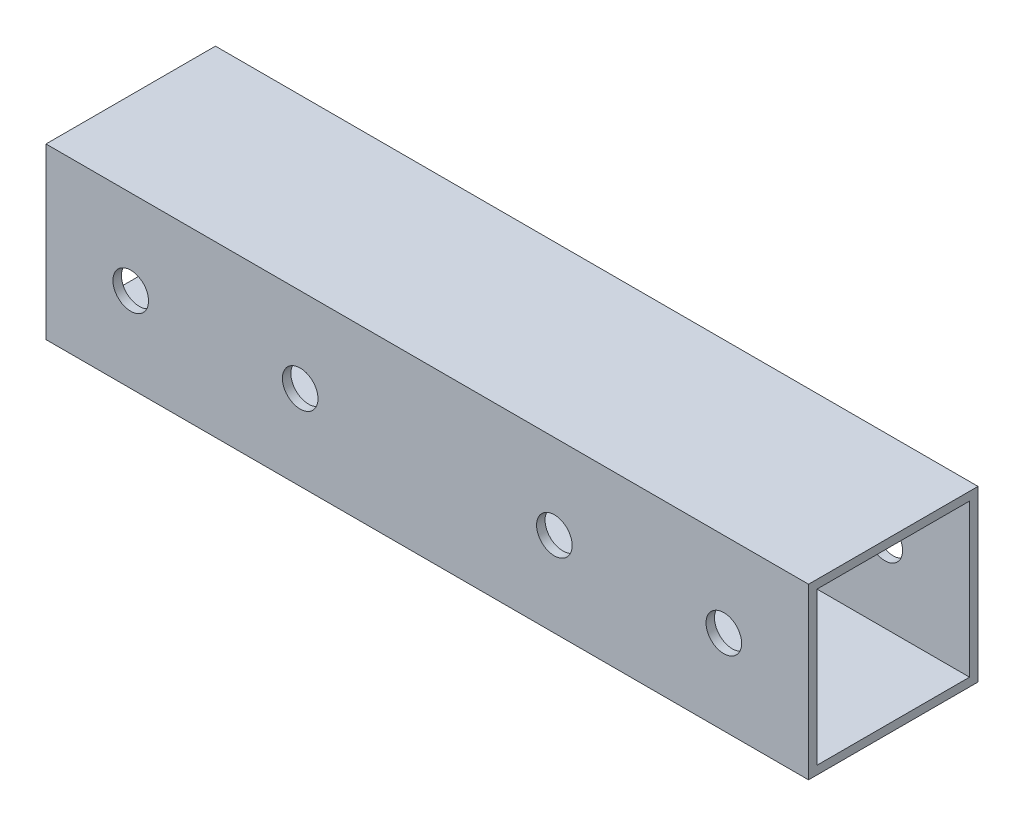
ISO-10303-21;
HEADER;
FILE_DESCRIPTION(('STEP AP214'),'2;1');
FILE_NAME('part.step','',(''),(''),'','','');
FILE_SCHEMA(('AUTOMOTIVE_DESIGN { 1 0 10303 214 1 1 1 1 }'));
ENDSEC;
DATA;
#1=APPLICATION_CONTEXT('core data for automotive mechanical design processes');
#2=APPLICATION_PROTOCOL_DEFINITION('international standard','automotive_design',2000,#1);
#3=PRODUCT_CONTEXT('',#1,'mechanical');
#4=PRODUCT('Part','Part','',(#3));
#5=PRODUCT_RELATED_PRODUCT_CATEGORY('part','',(#4));
#6=PRODUCT_DEFINITION_FORMATION('','',#4);
#7=PRODUCT_DEFINITION_CONTEXT('part definition',#1,'design');
#8=PRODUCT_DEFINITION('design','',#6,#7);
#9=PRODUCT_DEFINITION_SHAPE('','',#8);
#10=(LENGTH_UNIT() NAMED_UNIT(*) SI_UNIT(.MILLI.,.METRE.));
#11=(NAMED_UNIT(*) PLANE_ANGLE_UNIT() SI_UNIT($,.RADIAN.));
#12=(NAMED_UNIT(*) SI_UNIT($,.STERADIAN.) SOLID_ANGLE_UNIT());
#13=UNCERTAINTY_MEASURE_WITH_UNIT(LENGTH_MEASURE(1.E-05),#10,'distance_accuracy_value','');
#14=(GEOMETRIC_REPRESENTATION_CONTEXT(3) GLOBAL_UNCERTAINTY_ASSIGNED_CONTEXT((#13)) GLOBAL_UNIT_ASSIGNED_CONTEXT((#10,
#11,#12)) REPRESENTATION_CONTEXT('',''));
#15=CARTESIAN_POINT('',(0.,0.,0.));
#16=DIRECTION('',(0.,0.,1.));
#17=DIRECTION('',(1.,0.,0.));
#18=AXIS2_PLACEMENT_3D('',#15,#16,#17);
#19=CARTESIAN_POINT('',(80.,0.,-10.));
#20=DIRECTION('',(0.,0.,1.));
#21=DIRECTION('',(1.,0.,0.));
#22=AXIS2_PLACEMENT_3D('',#19,#20,#21);
#23=CYLINDRICAL_SURFACE('',#22,2.09999999999999);
#24=CARTESIAN_POINT('',(80.,0.,9.));
#25=DIRECTION('',(0.,0.,1.));
#26=DIRECTION('',(0.,-1.,0.));
#27=AXIS2_PLACEMENT_3D('',#24,#25,#26);
#28=CIRCLE('',#27,2.09999999999999);
#29=CARTESIAN_POINT('',(80.,-2.09999999999999,9.));
#30=VERTEX_POINT('',#29);
#31=EDGE_CURVE('E183',#30,#30,#28,.F.);
#32=ORIENTED_EDGE('',*,*,#31,.T.);
#33=EDGE_LOOP('',(#32));
#34=FACE_BOUND('',#33,.T.);
#35=CARTESIAN_POINT('',(80.,0.,9.99999999999999));
#36=DIRECTION('',(0.,0.,1.));
#37=DIRECTION('',(-1.,0.,0.));
#38=AXIS2_PLACEMENT_3D('',#35,#36,#37);
#39=CIRCLE('',#38,2.09999999999999);
#40=CARTESIAN_POINT('',(77.9,0.,9.99999999999999));
#41=VERTEX_POINT('',#40);
#42=EDGE_CURVE('E187',#41,#41,#39,.T.);
#43=ORIENTED_EDGE('',*,*,#42,.T.);
#44=EDGE_LOOP('',(#43));
#45=FACE_BOUND('',#44,.T.);
#46=ADVANCED_FACE('F42',(#34,#45),#23,.F.);
#47=CARTESIAN_POINT('',(60.,0.,-10.));
#48=DIRECTION('',(0.,0.,1.));
#49=DIRECTION('',(1.,0.,0.));
#50=AXIS2_PLACEMENT_3D('',#47,#48,#49);
#51=CYLINDRICAL_SURFACE('',#50,2.1);
#52=CARTESIAN_POINT('',(60.,0.,9.));
#53=DIRECTION('',(0.,0.,1.));
#54=DIRECTION('',(0.,-1.,0.));
#55=AXIS2_PLACEMENT_3D('',#52,#53,#54);
#56=CIRCLE('',#55,2.1);
#57=CARTESIAN_POINT('',(60.,-2.1,9.));
#58=VERTEX_POINT('',#57);
#59=EDGE_CURVE('E179',#58,#58,#56,.F.);
#60=ORIENTED_EDGE('',*,*,#59,.T.);
#61=EDGE_LOOP('',(#60));
#62=FACE_BOUND('',#61,.T.);
#63=CARTESIAN_POINT('',(60.,0.,9.99999999999999));
#64=DIRECTION('',(0.,0.,1.));
#65=DIRECTION('',(-1.,0.,0.));
#66=AXIS2_PLACEMENT_3D('',#63,#64,#65);
#67=CIRCLE('',#66,2.1);
#68=CARTESIAN_POINT('',(57.9,0.,9.99999999999999));
#69=VERTEX_POINT('',#68);
#70=EDGE_CURVE('E209',#69,#69,#67,.T.);
#71=ORIENTED_EDGE('',*,*,#70,.T.);
#72=EDGE_LOOP('',(#71));
#73=FACE_BOUND('',#72,.T.);
#74=ADVANCED_FACE('F312',(#62,#73),#51,.F.);
#75=CARTESIAN_POINT('',(30.,0.,-10.));
#76=DIRECTION('',(0.,0.,1.));
#77=DIRECTION('',(1.,0.,0.));
#78=AXIS2_PLACEMENT_3D('',#75,#76,#77);
#79=CYLINDRICAL_SURFACE('',#78,2.1);
#80=CARTESIAN_POINT('',(30.,0.,9.));
#81=DIRECTION('',(0.,0.,1.));
#82=DIRECTION('',(0.,-1.,0.));
#83=AXIS2_PLACEMENT_3D('',#80,#81,#82);
#84=CIRCLE('',#83,2.1);
#85=CARTESIAN_POINT('',(30.,-2.1,9.));
#86=VERTEX_POINT('',#85);
#87=EDGE_CURVE('E175',#86,#86,#84,.F.);
#88=ORIENTED_EDGE('',*,*,#87,.T.);
#89=EDGE_LOOP('',(#88));
#90=FACE_BOUND('',#89,.T.);
#91=CARTESIAN_POINT('',(30.,0.,9.99999999999999));
#92=DIRECTION('',(0.,0.,1.));
#93=DIRECTION('',(1.,0.,0.));
#94=AXIS2_PLACEMENT_3D('',#91,#92,#93);
#95=CIRCLE('',#94,2.1);
#96=CARTESIAN_POINT('',(32.1,0.,9.99999999999999));
#97=VERTEX_POINT('',#96);
#98=EDGE_CURVE('E201',#97,#97,#95,.T.);
#99=ORIENTED_EDGE('',*,*,#98,.T.);
#100=EDGE_LOOP('',(#99));
#101=FACE_BOUND('',#100,.T.);
#102=ADVANCED_FACE('F316',(#90,#101),#79,.F.);
#103=CARTESIAN_POINT('',(10.,0.,-10.));
#104=DIRECTION('',(0.,0.,1.));
#105=DIRECTION('',(1.,0.,0.));
#106=AXIS2_PLACEMENT_3D('',#103,#104,#105);
#107=CYLINDRICAL_SURFACE('',#106,2.1);
#108=CARTESIAN_POINT('',(10.,0.,9.));
#109=DIRECTION('',(0.,0.,1.));
#110=DIRECTION('',(0.,-1.,0.));
#111=AXIS2_PLACEMENT_3D('',#108,#109,#110);
#112=CIRCLE('',#111,2.1);
#113=CARTESIAN_POINT('',(10.,-2.1,9.));
#114=VERTEX_POINT('',#113);
#115=EDGE_CURVE('E46',#114,#114,#112,.F.);
#116=ORIENTED_EDGE('',*,*,#115,.T.);
#117=EDGE_LOOP('',(#116));
#118=FACE_BOUND('',#117,.T.);
#119=CARTESIAN_POINT('',(10.,0.,9.99999999999999));
#120=DIRECTION('',(0.,0.,1.));
#121=DIRECTION('',(1.,0.,0.));
#122=AXIS2_PLACEMENT_3D('',#119,#120,#121);
#123=CIRCLE('',#122,2.1);
#124=CARTESIAN_POINT('',(12.1,0.,9.99999999999999));
#125=VERTEX_POINT('',#124);
#126=EDGE_CURVE('E193',#125,#125,#123,.T.);
#127=ORIENTED_EDGE('',*,*,#126,.T.);
#128=EDGE_LOOP('',(#127));
#129=FACE_BOUND('',#128,.T.);
#130=ADVANCED_FACE('F284',(#118,#129),#107,.F.);
#131=CARTESIAN_POINT('',(90.,10.,-10.));
#132=DIRECTION('',(0.,0.,1.));
#133=DIRECTION('',(0.,-1.,0.));
#134=AXIS2_PLACEMENT_3D('',#131,#132,#133);
#135=PLANE('',#134);
#136=CARTESIAN_POINT('',(10.,0.,-10.));
#137=DIRECTION('',(0.,0.,1.));
#138=DIRECTION('',(1.,0.,0.));
#139=AXIS2_PLACEMENT_3D('',#136,#137,#138);
#140=CIRCLE('',#139,2.1);
#141=CARTESIAN_POINT('',(12.1,0.,-10.));
#142=VERTEX_POINT('',#141);
#143=EDGE_CURVE('E188',#142,#142,#140,.T.);
#144=ORIENTED_EDGE('',*,*,#143,.T.);
#145=EDGE_LOOP('',(#144));
#146=FACE_BOUND('',#145,.T.);
#147=CARTESIAN_POINT('',(30.,0.,-10.));
#148=DIRECTION('',(0.,0.,1.));
#149=DIRECTION('',(1.,0.,0.));
#150=AXIS2_PLACEMENT_3D('',#147,#148,#149);
#151=CIRCLE('',#150,2.1);
#152=CARTESIAN_POINT('',(32.1,0.,-10.));
#153=VERTEX_POINT('',#152);
#154=EDGE_CURVE('E197',#153,#153,#151,.T.);
#155=ORIENTED_EDGE('',*,*,#154,.T.);
#156=EDGE_LOOP('',(#155));
#157=FACE_BOUND('',#156,.T.);
#158=CARTESIAN_POINT('',(60.,0.,-10.));
#159=DIRECTION('',(0.,0.,1.));
#160=DIRECTION('',(-1.,0.,0.));
#161=AXIS2_PLACEMENT_3D('',#158,#159,#160);
#162=CIRCLE('',#161,2.1);
#163=CARTESIAN_POINT('',(57.9,0.,-10.));
#164=VERTEX_POINT('',#163);
#165=EDGE_CURVE('E205',#164,#164,#162,.T.);
#166=ORIENTED_EDGE('',*,*,#165,.T.);
#167=EDGE_LOOP('',(#166));
#168=FACE_BOUND('',#167,.T.);
#169=CARTESIAN_POINT('',(80.,0.,-10.));
#170=DIRECTION('',(0.,0.,1.));
#171=DIRECTION('',(-1.,0.,0.));
#172=AXIS2_PLACEMENT_3D('',#169,#170,#171);
#173=CIRCLE('',#172,2.09999999999999);
#174=CARTESIAN_POINT('',(77.9,0.,-10.));
#175=VERTEX_POINT('',#174);
#176=EDGE_CURVE('E213',#175,#175,#173,.T.);
#177=ORIENTED_EDGE('',*,*,#176,.T.);
#178=EDGE_LOOP('',(#177));
#179=FACE_BOUND('',#178,.T.);
#180=DIRECTION('',(0.,1.,0.));
#181=VECTOR('',#180,1.);
#182=CARTESIAN_POINT('',(0.,10.,-10.));
#183=LINE('',#182,#181);
#184=CARTESIAN_POINT('',(0.,-9.99999999999999,-10.));
#185=VERTEX_POINT('',#184);
#186=CARTESIAN_POINT('',(0.,10.,-10.));
#187=VERTEX_POINT('',#186);
#188=EDGE_CURVE('E192',#185,#187,#183,.T.);
#189=ORIENTED_EDGE('',*,*,#188,.T.);
#190=DIRECTION('',(-1.,0.,0.));
#191=VECTOR('',#190,1.);
#192=CARTESIAN_POINT('',(90.,10.,-10.));
#193=LINE('',#192,#191);
#194=CARTESIAN_POINT('',(90.,10.,-10.));
#195=VERTEX_POINT('',#194);
#196=EDGE_CURVE('E11',#195,#187,#193,.T.);
#197=ORIENTED_EDGE('',*,*,#196,.F.);
#198=DIRECTION('',(0.,1.,0.));
#199=VECTOR('',#198,1.);
#200=CARTESIAN_POINT('',(90.,10.,-10.));
#201=LINE('',#200,#199);
#202=CARTESIAN_POINT('',(90.,-9.99999999999999,-10.));
#203=VERTEX_POINT('',#202);
#204=EDGE_CURVE('E220',#203,#195,#201,.T.);
#205=ORIENTED_EDGE('',*,*,#204,.F.);
#206=DIRECTION('',(-1.,0.,0.));
#207=VECTOR('',#206,1.);
#208=CARTESIAN_POINT('',(90.,-9.99999999999999,-10.));
#209=LINE('',#208,#207);
#210=EDGE_CURVE('E234',#203,#185,#209,.T.);
#211=ORIENTED_EDGE('',*,*,#210,.T.);
#212=EDGE_LOOP('',(#189,#197,#205,#211));
#213=FACE_BOUND('',#212,.T.);
#214=ADVANCED_FACE('F44',(#146,#157,#168,#179,#213),#135,.F.);
#215=CARTESIAN_POINT('',(90.,10.,9.99999999999999));
#216=DIRECTION('',(0.,-1.,0.));
#217=DIRECTION('',(0.,0.,-1.));
#218=AXIS2_PLACEMENT_3D('',#215,#216,#217);
#219=PLANE('',#218);
#220=DIRECTION('',(0.,0.,1.));
#221=VECTOR('',#220,1.);
#222=CARTESIAN_POINT('',(0.,10.,9.99999999999999));
#223=LINE('',#222,#221);
#224=CARTESIAN_POINT('',(0.,10.,9.99999999999999));
#225=VERTEX_POINT('',#224);
#226=EDGE_CURVE('E238',#187,#225,#223,.T.);
#227=ORIENTED_EDGE('',*,*,#226,.T.);
#228=DIRECTION('',(-1.,0.,0.));
#229=VECTOR('',#228,1.);
#230=CARTESIAN_POINT('',(90.,10.,9.99999999999999));
#231=LINE('',#230,#229);
#232=CARTESIAN_POINT('',(90.,10.,9.99999999999999));
#233=VERTEX_POINT('',#232);
#234=EDGE_CURVE('E52',#233,#225,#231,.T.);
#235=ORIENTED_EDGE('',*,*,#234,.F.);
#236=DIRECTION('',(0.,0.,1.));
#237=VECTOR('',#236,1.);
#238=CARTESIAN_POINT('',(90.,10.,9.99999999999999));
#239=LINE('',#238,#237);
#240=EDGE_CURVE('E224',#195,#233,#239,.T.);
#241=ORIENTED_EDGE('',*,*,#240,.F.);
#242=ORIENTED_EDGE('',*,*,#196,.T.);
#243=EDGE_LOOP('',(#227,#235,#241,#242));
#244=FACE_BOUND('',#243,.T.);
#245=ADVANCED_FACE('F283',(#244),#219,.F.);
#246=CARTESIAN_POINT('',(90.,10.,9.99999999999999));
#247=DIRECTION('',(0.,0.,-1.));
#248=DIRECTION('',(0.,1.,0.));
#249=AXIS2_PLACEMENT_3D('',#246,#247,#248);
#250=PLANE('',#249);
#251=ORIENTED_EDGE('',*,*,#126,.F.);
#252=EDGE_LOOP('',(#251));
#253=FACE_BOUND('',#252,.T.);
#254=ORIENTED_EDGE('',*,*,#98,.F.);
#255=EDGE_LOOP('',(#254));
#256=FACE_BOUND('',#255,.T.);
#257=ORIENTED_EDGE('',*,*,#70,.F.);
#258=EDGE_LOOP('',(#257));
#259=FACE_BOUND('',#258,.T.);
#260=ORIENTED_EDGE('',*,*,#42,.F.);
#261=EDGE_LOOP('',(#260));
#262=FACE_BOUND('',#261,.T.);
#263=DIRECTION('',(0.,-1.,0.));
#264=VECTOR('',#263,1.);
#265=CARTESIAN_POINT('',(0.,10.,9.99999999999999));
#266=LINE('',#265,#264);
#267=CARTESIAN_POINT('',(0.,-9.99999999999999,9.99999999999999));
#268=VERTEX_POINT('',#267);
#269=EDGE_CURVE('E241',#225,#268,#266,.T.);
#270=ORIENTED_EDGE('',*,*,#269,.T.);
#271=DIRECTION('',(-1.,0.,0.));
#272=VECTOR('',#271,1.);
#273=CARTESIAN_POINT('',(90.,-9.99999999999999,9.99999999999999));
#274=LINE('',#273,#272);
#275=CARTESIAN_POINT('',(90.,-9.99999999999999,9.99999999999999));
#276=VERTEX_POINT('',#275);
#277=EDGE_CURVE('E248',#276,#268,#274,.T.);
#278=ORIENTED_EDGE('',*,*,#277,.F.);
#279=DIRECTION('',(0.,-1.,0.));
#280=VECTOR('',#279,1.);
#281=CARTESIAN_POINT('',(90.,10.,9.99999999999999));
#282=LINE('',#281,#280);
#283=EDGE_CURVE('E228',#233,#276,#282,.T.);
#284=ORIENTED_EDGE('',*,*,#283,.F.);
#285=ORIENTED_EDGE('',*,*,#234,.T.);
#286=EDGE_LOOP('',(#270,#278,#284,#285));
#287=FACE_BOUND('',#286,.T.);
#288=ADVANCED_FACE('F301',(#253,#256,#259,#262,#287),#250,.F.);
#289=CARTESIAN_POINT('',(90.,-9.99999999999999,9.99999999999999));
#290=DIRECTION('',(0.,1.,0.));
#291=DIRECTION('',(0.,0.,1.));
#292=AXIS2_PLACEMENT_3D('',#289,#290,#291);
#293=PLANE('',#292);
#294=DIRECTION('',(0.,0.,-1.));
#295=VECTOR('',#294,1.);
#296=CARTESIAN_POINT('',(0.,-9.99999999999999,9.99999999999999));
#297=LINE('',#296,#295);
#298=EDGE_CURVE('E225',#268,#185,#297,.T.);
#299=ORIENTED_EDGE('',*,*,#298,.T.);
#300=ORIENTED_EDGE('',*,*,#210,.F.);
#301=DIRECTION('',(0.,0.,-1.));
#302=VECTOR('',#301,1.);
#303=CARTESIAN_POINT('',(90.,-9.99999999999999,9.99999999999999));
#304=LINE('',#303,#302);
#305=EDGE_CURVE('E231',#276,#203,#304,.T.);
#306=ORIENTED_EDGE('',*,*,#305,.F.);
#307=ORIENTED_EDGE('',*,*,#277,.T.);
#308=EDGE_LOOP('',(#299,#300,#306,#307));
#309=FACE_BOUND('',#308,.T.);
#310=ADVANCED_FACE('F299',(#309),#293,.F.);
#311=CARTESIAN_POINT('',(90.,0.,0.));
#312=DIRECTION('',(1.,0.,0.));
#313=DIRECTION('',(0.,0.,-1.));
#314=AXIS2_PLACEMENT_3D('',#311,#312,#313);
#315=PLANE('',#314);
#316=DIRECTION('',(0.,1.,0.));
#317=VECTOR('',#316,1.);
#318=CARTESIAN_POINT('',(90.,9.,9.));
#319=LINE('',#318,#317);
#320=CARTESIAN_POINT('',(90.,-9.,9.));
#321=VERTEX_POINT('',#320);
#322=CARTESIAN_POINT('',(90.,9.,9.));
#323=VERTEX_POINT('',#322);
#324=EDGE_CURVE('E113',#321,#323,#319,.T.);
#325=ORIENTED_EDGE('',*,*,#324,.T.);
#326=DIRECTION('',(0.,0.,-1.));
#327=VECTOR('',#326,1.);
#328=CARTESIAN_POINT('',(90.,9.,-9.));
#329=LINE('',#328,#327);
#330=CARTESIAN_POINT('',(90.,9.,-9.));
#331=VERTEX_POINT('',#330);
#332=EDGE_CURVE('E123',#323,#331,#329,.T.);
#333=ORIENTED_EDGE('',*,*,#332,.T.);
#334=DIRECTION('',(0.,-1.,0.));
#335=VECTOR('',#334,1.);
#336=CARTESIAN_POINT('',(90.,9.,-9.));
#337=LINE('',#336,#335);
#338=CARTESIAN_POINT('',(90.,-9.,-9.));
#339=VERTEX_POINT('',#338);
#340=EDGE_CURVE('E60',#331,#339,#337,.T.);
#341=ORIENTED_EDGE('',*,*,#340,.T.);
#342=DIRECTION('',(0.,0.,1.));
#343=VECTOR('',#342,1.);
#344=CARTESIAN_POINT('',(90.,-9.,-9.));
#345=LINE('',#344,#343);
#346=EDGE_CURVE('E120',#339,#321,#345,.T.);
#347=ORIENTED_EDGE('',*,*,#346,.T.);
#348=EDGE_LOOP('',(#325,#333,#341,#347));
#349=FACE_BOUND('',#348,.T.);
#350=ORIENTED_EDGE('',*,*,#204,.T.);
#351=ORIENTED_EDGE('',*,*,#240,.T.);
#352=ORIENTED_EDGE('',*,*,#283,.T.);
#353=ORIENTED_EDGE('',*,*,#305,.T.);
#354=EDGE_LOOP('',(#350,#351,#352,#353));
#355=FACE_BOUND('',#354,.T.);
#356=ADVANCED_FACE('F128',(#349,#355),#315,.T.);
#357=CARTESIAN_POINT('',(0.,0.,0.));
#358=DIRECTION('',(1.,0.,0.));
#359=DIRECTION('',(0.,0.,-1.));
#360=AXIS2_PLACEMENT_3D('',#357,#358,#359);
#361=PLANE('',#360);
#362=DIRECTION('',(0.,0.,-1.));
#363=VECTOR('',#362,1.);
#364=CARTESIAN_POINT('',(0.,9.,-9.));
#365=LINE('',#364,#363);
#366=CARTESIAN_POINT('',(0.,9.,9.));
#367=VERTEX_POINT('',#366);
#368=CARTESIAN_POINT('',(0.,9.,-9.));
#369=VERTEX_POINT('',#368);
#370=EDGE_CURVE('E148',#367,#369,#365,.T.);
#371=ORIENTED_EDGE('',*,*,#370,.F.);
#372=DIRECTION('',(0.,1.,0.));
#373=VECTOR('',#372,1.);
#374=CARTESIAN_POINT('',(0.,9.,9.));
#375=LINE('',#374,#373);
#376=CARTESIAN_POINT('',(0.,-9.,9.));
#377=VERTEX_POINT('',#376);
#378=EDGE_CURVE('E68',#377,#367,#375,.T.);
#379=ORIENTED_EDGE('',*,*,#378,.F.);
#380=DIRECTION('',(0.,0.,1.));
#381=VECTOR('',#380,1.);
#382=CARTESIAN_POINT('',(0.,-9.,-9.));
#383=LINE('',#382,#381);
#384=CARTESIAN_POINT('',(0.,-9.,-9.));
#385=VERTEX_POINT('',#384);
#386=EDGE_CURVE('E132',#385,#377,#383,.T.);
#387=ORIENTED_EDGE('',*,*,#386,.F.);
#388=DIRECTION('',(0.,-1.,0.));
#389=VECTOR('',#388,1.);
#390=CARTESIAN_POINT('',(0.,9.,-9.));
#391=LINE('',#390,#389);
#392=EDGE_CURVE('E139',#369,#385,#391,.T.);
#393=ORIENTED_EDGE('',*,*,#392,.F.);
#394=EDGE_LOOP('',(#371,#379,#387,#393));
#395=FACE_BOUND('',#394,.T.);
#396=ORIENTED_EDGE('',*,*,#188,.F.);
#397=ORIENTED_EDGE('',*,*,#298,.F.);
#398=ORIENTED_EDGE('',*,*,#269,.F.);
#399=ORIENTED_EDGE('',*,*,#226,.F.);
#400=EDGE_LOOP('',(#396,#397,#398,#399));
#401=FACE_BOUND('',#400,.T.);
#402=ADVANCED_FACE('F277',(#395,#401),#361,.F.);
#403=CARTESIAN_POINT('',(80.,0.,-9.));
#404=DIRECTION('',(0.,0.,-1.));
#405=DIRECTION('',(0.,1.,0.));
#406=AXIS2_PLACEMENT_3D('',#403,#404,#405);
#407=CIRCLE('',#406,2.09999999999999);
#408=CARTESIAN_POINT('',(80.,2.09999999999999,-9.));
#409=VERTEX_POINT('',#408);
#410=EDGE_CURVE('E171',#409,#409,#407,.F.);
#411=ORIENTED_EDGE('',*,*,#410,.T.);
#412=EDGE_LOOP('',(#411));
#413=FACE_BOUND('',#412,.T.);
#414=ORIENTED_EDGE('',*,*,#176,.F.);
#415=EDGE_LOOP('',(#414));
#416=FACE_BOUND('',#415,.T.);
#417=ADVANCED_FACE('F273',(#413,#416),#23,.F.);
#418=CARTESIAN_POINT('',(60.,0.,-9.));
#419=DIRECTION('',(0.,0.,-1.));
#420=DIRECTION('',(0.,1.,0.));
#421=AXIS2_PLACEMENT_3D('',#418,#419,#420);
#422=CIRCLE('',#421,2.1);
#423=CARTESIAN_POINT('',(60.,2.1,-9.));
#424=VERTEX_POINT('',#423);
#425=EDGE_CURVE('E167',#424,#424,#422,.F.);
#426=ORIENTED_EDGE('',*,*,#425,.T.);
#427=EDGE_LOOP('',(#426));
#428=FACE_BOUND('',#427,.T.);
#429=ORIENTED_EDGE('',*,*,#165,.F.);
#430=EDGE_LOOP('',(#429));
#431=FACE_BOUND('',#430,.T.);
#432=ADVANCED_FACE('F276',(#428,#431),#51,.F.);
#433=CARTESIAN_POINT('',(30.,0.,-9.));
#434=DIRECTION('',(0.,0.,-1.));
#435=DIRECTION('',(0.,1.,0.));
#436=AXIS2_PLACEMENT_3D('',#433,#434,#435);
#437=CIRCLE('',#436,2.1);
#438=CARTESIAN_POINT('',(30.,2.1,-9.));
#439=VERTEX_POINT('',#438);
#440=EDGE_CURVE('E163',#439,#439,#437,.F.);
#441=ORIENTED_EDGE('',*,*,#440,.T.);
#442=EDGE_LOOP('',(#441));
#443=FACE_BOUND('',#442,.T.);
#444=ORIENTED_EDGE('',*,*,#154,.F.);
#445=EDGE_LOOP('',(#444));
#446=FACE_BOUND('',#445,.T.);
#447=ADVANCED_FACE('F339',(#443,#446),#79,.F.);
#448=CARTESIAN_POINT('',(10.,0.,-9.));
#449=DIRECTION('',(0.,0.,-1.));
#450=DIRECTION('',(0.,1.,0.));
#451=AXIS2_PLACEMENT_3D('',#448,#449,#450);
#452=CIRCLE('',#451,2.1);
#453=CARTESIAN_POINT('',(10.,2.1,-9.));
#454=VERTEX_POINT('',#453);
#455=EDGE_CURVE('E157',#454,#454,#452,.F.);
#456=ORIENTED_EDGE('',*,*,#455,.T.);
#457=EDGE_LOOP('',(#456));
#458=FACE_BOUND('',#457,.T.);
#459=ORIENTED_EDGE('',*,*,#143,.F.);
#460=EDGE_LOOP('',(#459));
#461=FACE_BOUND('',#460,.T.);
#462=ADVANCED_FACE('F258',(#458,#461),#107,.F.);
#463=CARTESIAN_POINT('',(90.,9.,9.));
#464=DIRECTION('',(0.,0.,1.));
#465=DIRECTION('',(0.,-1.,0.));
#466=AXIS2_PLACEMENT_3D('',#463,#464,#465);
#467=PLANE('',#466);
#468=ORIENTED_EDGE('',*,*,#59,.F.);
#469=EDGE_LOOP('',(#468));
#470=FACE_BOUND('',#469,.T.);
#471=ORIENTED_EDGE('',*,*,#115,.F.);
#472=EDGE_LOOP('',(#471));
#473=FACE_BOUND('',#472,.T.);
#474=ORIENTED_EDGE('',*,*,#378,.T.);
#475=DIRECTION('',(-1.,0.,0.));
#476=VECTOR('',#475,1.);
#477=CARTESIAN_POINT('',(90.,9.,9.));
#478=LINE('',#477,#476);
#479=EDGE_CURVE('E108',#323,#367,#478,.T.);
#480=ORIENTED_EDGE('',*,*,#479,.F.);
#481=ORIENTED_EDGE('',*,*,#324,.F.);
#482=DIRECTION('',(-1.,0.,0.));
#483=VECTOR('',#482,1.);
#484=CARTESIAN_POINT('',(90.,-9.,9.));
#485=LINE('',#484,#483);
#486=EDGE_CURVE('E154',#321,#377,#485,.T.);
#487=ORIENTED_EDGE('',*,*,#486,.T.);
#488=EDGE_LOOP('',(#474,#480,#481,#487));
#489=FACE_BOUND('',#488,.T.);
#490=ORIENTED_EDGE('',*,*,#87,.F.);
#491=EDGE_LOOP('',(#490));
#492=FACE_BOUND('',#491,.T.);
#493=ORIENTED_EDGE('',*,*,#31,.F.);
#494=EDGE_LOOP('',(#493));
#495=FACE_BOUND('',#494,.T.);
#496=ADVANCED_FACE('F110',(#470,#473,#489,#492,#495),#467,.F.);
#497=CARTESIAN_POINT('',(90.,9.,-9.));
#498=DIRECTION('',(0.,0.,-1.));
#499=DIRECTION('',(0.,1.,0.));
#500=AXIS2_PLACEMENT_3D('',#497,#498,#499);
#501=PLANE('',#500);
#502=ORIENTED_EDGE('',*,*,#425,.F.);
#503=EDGE_LOOP('',(#502));
#504=FACE_BOUND('',#503,.T.);
#505=ORIENTED_EDGE('',*,*,#455,.F.);
#506=EDGE_LOOP('',(#505));
#507=FACE_BOUND('',#506,.T.);
#508=ORIENTED_EDGE('',*,*,#392,.T.);
#509=DIRECTION('',(-1.,0.,0.));
#510=VECTOR('',#509,1.);
#511=CARTESIAN_POINT('',(90.,-9.,-9.));
#512=LINE('',#511,#510);
#513=EDGE_CURVE('E158',#339,#385,#512,.T.);
#514=ORIENTED_EDGE('',*,*,#513,.F.);
#515=ORIENTED_EDGE('',*,*,#340,.F.);
#516=DIRECTION('',(-1.,0.,0.));
#517=VECTOR('',#516,1.);
#518=CARTESIAN_POINT('',(90.,9.,-9.));
#519=LINE('',#518,#517);
#520=EDGE_CURVE('E119',#331,#369,#519,.T.);
#521=ORIENTED_EDGE('',*,*,#520,.T.);
#522=EDGE_LOOP('',(#508,#514,#515,#521));
#523=FACE_BOUND('',#522,.T.);
#524=ORIENTED_EDGE('',*,*,#440,.F.);
#525=EDGE_LOOP('',(#524));
#526=FACE_BOUND('',#525,.T.);
#527=ORIENTED_EDGE('',*,*,#410,.F.);
#528=EDGE_LOOP('',(#527));
#529=FACE_BOUND('',#528,.T.);
#530=ADVANCED_FACE('F261',(#504,#507,#523,#526,#529),#501,.F.);
#531=CARTESIAN_POINT('',(90.,-9.,-9.));
#532=DIRECTION('',(0.,-1.,0.));
#533=DIRECTION('',(0.,0.,-1.));
#534=AXIS2_PLACEMENT_3D('',#531,#532,#533);
#535=PLANE('',#534);
#536=ORIENTED_EDGE('',*,*,#386,.T.);
#537=ORIENTED_EDGE('',*,*,#486,.F.);
#538=ORIENTED_EDGE('',*,*,#346,.F.);
#539=ORIENTED_EDGE('',*,*,#513,.T.);
#540=EDGE_LOOP('',(#536,#537,#538,#539));
#541=FACE_BOUND('',#540,.T.);
#542=ADVANCED_FACE('F263',(#541),#535,.F.);
#543=CARTESIAN_POINT('',(90.,9.,-9.));
#544=DIRECTION('',(0.,1.,0.));
#545=DIRECTION('',(0.,0.,1.));
#546=AXIS2_PLACEMENT_3D('',#543,#544,#545);
#547=PLANE('',#546);
#548=ORIENTED_EDGE('',*,*,#370,.T.);
#549=ORIENTED_EDGE('',*,*,#520,.F.);
#550=ORIENTED_EDGE('',*,*,#332,.F.);
#551=ORIENTED_EDGE('',*,*,#479,.T.);
#552=EDGE_LOOP('',(#548,#549,#550,#551));
#553=FACE_BOUND('',#552,.T.);
#554=ADVANCED_FACE('F124',(#553),#547,.F.);
#555=CLOSED_SHELL('',(#46,#74,#102,#130,#214,#245,#288,#310,#356,#402,#417,#432,#447,#462,#496,
#530,#542,#554));
#556=MANIFOLD_SOLID_BREP('B2',#555);
#557=ADVANCED_BREP_SHAPE_REPRESENTATION('',(#18,#556),#14);
#558=SHAPE_DEFINITION_REPRESENTATION(#9,#557);
ENDSEC;
END-ISO-10303-21;
